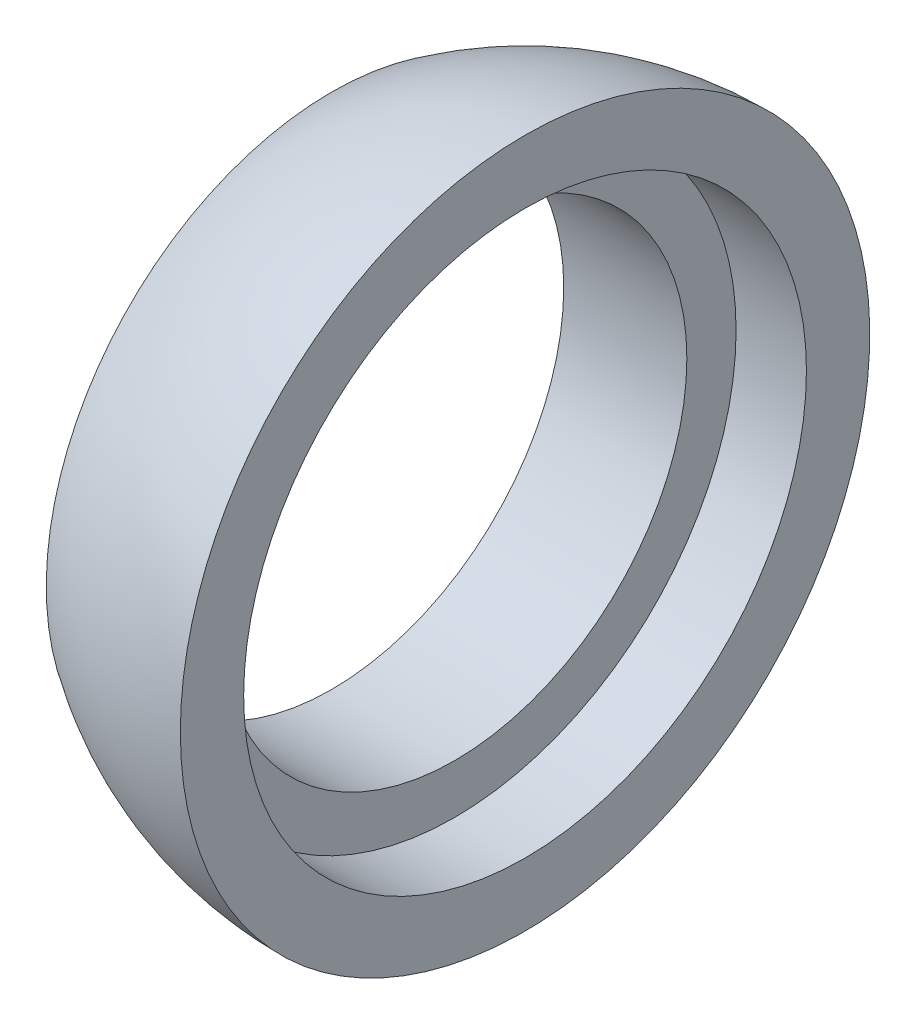
ISO-10303-21;
HEADER;
FILE_DESCRIPTION(('STEP AP214'),'2;1');
FILE_NAME('part.step','',(''),(''),'','','');
FILE_SCHEMA(('AUTOMOTIVE_DESIGN { 1 0 10303 214 1 1 1 1 }'));
ENDSEC;
DATA;
#1=APPLICATION_CONTEXT('core data for automotive mechanical design processes');
#2=APPLICATION_PROTOCOL_DEFINITION('international standard','automotive_design',2000,#1);
#3=PRODUCT_CONTEXT('',#1,'mechanical');
#4=PRODUCT('Part','Part','',(#3));
#5=PRODUCT_RELATED_PRODUCT_CATEGORY('part','',(#4));
#6=PRODUCT_DEFINITION_FORMATION('','',#4);
#7=PRODUCT_DEFINITION_CONTEXT('part definition',#1,'design');
#8=PRODUCT_DEFINITION('design','',#6,#7);
#9=PRODUCT_DEFINITION_SHAPE('','',#8);
#10=(LENGTH_UNIT() NAMED_UNIT(*) SI_UNIT(.MILLI.,.METRE.));
#11=(NAMED_UNIT(*) PLANE_ANGLE_UNIT() SI_UNIT($,.RADIAN.));
#12=(NAMED_UNIT(*) SI_UNIT($,.STERADIAN.) SOLID_ANGLE_UNIT());
#13=UNCERTAINTY_MEASURE_WITH_UNIT(LENGTH_MEASURE(1.E-05),#10,'distance_accuracy_value','');
#14=(GEOMETRIC_REPRESENTATION_CONTEXT(3) GLOBAL_UNCERTAINTY_ASSIGNED_CONTEXT((#13)) GLOBAL_UNIT_ASSIGNED_CONTEXT((#10,
#11,#12)) REPRESENTATION_CONTEXT('',''));
#15=CARTESIAN_POINT('',(0.,0.,0.));
#16=DIRECTION('',(0.,0.,1.));
#17=DIRECTION('',(1.,0.,0.));
#18=AXIS2_PLACEMENT_3D('',#15,#16,#17);
#19=CARTESIAN_POINT('',(-5.5,0.,0.));
#20=DIRECTION('',(1.,0.,0.));
#21=DIRECTION('',(0.,0.,-1.));
#22=AXIS2_PLACEMENT_3D('',#19,#20,#21);
#23=CYLINDRICAL_SURFACE('',#22,6.6);
#24=CARTESIAN_POINT('',(-5.5,0.,0.));
#25=DIRECTION('',(1.,0.,0.));
#26=DIRECTION('',(0.,0.,-1.));
#27=AXIS2_PLACEMENT_3D('',#24,#25,#26);
#28=CIRCLE('',#27,6.6);
#29=CARTESIAN_POINT('',(-5.5,0.,-6.6));
#30=VERTEX_POINT('',#29);
#31=EDGE_CURVE('E58',#30,#30,#28,.T.);
#32=ORIENTED_EDGE('',*,*,#31,.F.);
#33=EDGE_LOOP('',(#32));
#34=FACE_BOUND('',#33,.T.);
#35=CARTESIAN_POINT('',(-2.,0.,0.));
#36=DIRECTION('',(1.,0.,0.));
#37=DIRECTION('',(0.,0.,-1.));
#38=AXIS2_PLACEMENT_3D('',#35,#36,#37);
#39=CIRCLE('',#38,6.6);
#40=CARTESIAN_POINT('',(-2.,0.,-6.6));
#41=VERTEX_POINT('',#40);
#42=EDGE_CURVE('E47',#41,#41,#39,.F.);
#43=ORIENTED_EDGE('',*,*,#42,.F.);
#44=EDGE_LOOP('',(#43));
#45=FACE_BOUND('',#44,.T.);
#46=ADVANCED_FACE('F43',(#34,#45),#23,.F.);
#47=CARTESIAN_POINT('',(0.,0.,0.));
#48=DIRECTION('',(0.,1.,0.));
#49=DIRECTION('',(0.,0.,1.));
#50=AXIS2_PLACEMENT_3D('',#47,#48,#49);
#51=SPHERICAL_SURFACE('',#50,9.8);
#52=CARTESIAN_POINT('',(0.,0.,0.));
#53=DIRECTION('',(1.,0.,0.));
#54=DIRECTION('',(0.,1.,0.));
#55=AXIS2_PLACEMENT_3D('',#52,#53,#54);
#56=SPHERICAL_SURFACE('',#55,9.8);
#57=CARTESIAN_POINT('',(-5.5,0.,0.));
#58=DIRECTION('',(1.,0.,0.));
#59=DIRECTION('',(0.,1.,0.));
#60=AXIS2_PLACEMENT_3D('',#57,#58,#59);
#61=CIRCLE('',#60,8.11110350075747);
#62=CARTESIAN_POINT('',(-5.5,8.11110350075747,0.));
#63=VERTEX_POINT('',#62);
#64=EDGE_CURVE('E52',#63,#63,#61,.F.);
#65=ORIENTED_EDGE('',*,*,#64,.F.);
#66=EDGE_LOOP('',(#65));
#67=FACE_BOUND('',#66,.T.);
#68=CARTESIAN_POINT('',(0.,0.,0.));
#69=DIRECTION('',(-1.,0.,0.));
#70=DIRECTION('',(0.,0.,1.));
#71=AXIS2_PLACEMENT_3D('',#68,#69,#70);
#72=CIRCLE('',#71,9.8);
#73=CARTESIAN_POINT('',(0.,0.,9.8));
#74=VERTEX_POINT('',#73);
#75=EDGE_CURVE('E10',#74,#74,#72,.T.);
#76=ORIENTED_EDGE('',*,*,#75,.T.);
#77=EDGE_LOOP('',(#76));
#78=FACE_BOUND('',#77,.T.);
#79=ADVANCED_FACE('F45',(#67,#78),#56,.T.);
#80=CARTESIAN_POINT('',(0.,0.,0.));
#81=DIRECTION('',(-1.,0.,0.));
#82=DIRECTION('',(0.,0.,1.));
#83=AXIS2_PLACEMENT_3D('',#80,#81,#82);
#84=PLANE('',#83);
#85=CARTESIAN_POINT('',(0.,0.,0.));
#86=DIRECTION('',(1.,0.,0.));
#87=DIRECTION('',(0.,0.,-1.));
#88=AXIS2_PLACEMENT_3D('',#85,#86,#87);
#89=CIRCLE('',#88,8.);
#90=CARTESIAN_POINT('',(0.,0.,-8.));
#91=VERTEX_POINT('',#90);
#92=EDGE_CURVE('E63',#91,#91,#89,.T.);
#93=ORIENTED_EDGE('',*,*,#92,.F.);
#94=EDGE_LOOP('',(#93));
#95=FACE_BOUND('',#94,.T.);
#96=ORIENTED_EDGE('',*,*,#75,.F.);
#97=EDGE_LOOP('',(#96));
#98=FACE_BOUND('',#97,.T.);
#99=ADVANCED_FACE('F86',(#95,#98),#84,.F.);
#100=CARTESIAN_POINT('',(-5.5,9.03868005999727,-9.8));
#101=DIRECTION('',(1.,0.,0.));
#102=DIRECTION('',(0.,1.,0.));
#103=AXIS2_PLACEMENT_3D('',#100,#101,#102);
#104=PLANE('',#103);
#105=ORIENTED_EDGE('',*,*,#31,.T.);
#106=EDGE_LOOP('',(#105));
#107=FACE_BOUND('',#106,.T.);
#108=ORIENTED_EDGE('',*,*,#64,.T.);
#109=EDGE_LOOP('',(#108));
#110=FACE_BOUND('',#109,.T.);
#111=ADVANCED_FACE('F93',(#107,#110),#104,.F.);
#112=CARTESIAN_POINT('',(-2.,0.,0.));
#113=DIRECTION('',(1.,0.,0.));
#114=DIRECTION('',(0.,0.,-1.));
#115=AXIS2_PLACEMENT_3D('',#112,#113,#114);
#116=PLANE('',#115);
#117=CARTESIAN_POINT('',(-2.,0.,0.));
#118=DIRECTION('',(1.,0.,0.));
#119=DIRECTION('',(0.,0.,-1.));
#120=AXIS2_PLACEMENT_3D('',#117,#118,#119);
#121=CIRCLE('',#120,8.);
#122=CARTESIAN_POINT('',(-2.,0.,-8.));
#123=VERTEX_POINT('',#122);
#124=EDGE_CURVE('E67',#123,#123,#121,.T.);
#125=ORIENTED_EDGE('',*,*,#124,.T.);
#126=EDGE_LOOP('',(#125));
#127=FACE_BOUND('',#126,.T.);
#128=ORIENTED_EDGE('',*,*,#42,.T.);
#129=EDGE_LOOP('',(#128));
#130=FACE_BOUND('',#129,.T.);
#131=ADVANCED_FACE('F76',(#127,#130),#116,.T.);
#132=CARTESIAN_POINT('',(-2.,0.,0.));
#133=DIRECTION('',(1.,0.,0.));
#134=DIRECTION('',(0.,0.,-1.));
#135=AXIS2_PLACEMENT_3D('',#132,#133,#134);
#136=CYLINDRICAL_SURFACE('',#135,8.);
#137=ORIENTED_EDGE('',*,*,#124,.F.);
#138=EDGE_LOOP('',(#137));
#139=FACE_BOUND('',#138,.T.);
#140=ORIENTED_EDGE('',*,*,#92,.T.);
#141=EDGE_LOOP('',(#140));
#142=FACE_BOUND('',#141,.T.);
#143=ADVANCED_FACE('F91',(#139,#142),#136,.F.);
#144=CLOSED_SHELL('',(#46,#79,#99,#111,#131,#143));
#145=MANIFOLD_SOLID_BREP('B2',#144);
#146=ADVANCED_BREP_SHAPE_REPRESENTATION('',(#18,#145),#14);
#147=SHAPE_DEFINITION_REPRESENTATION(#9,#146);
ENDSEC;
END-ISO-10303-21;
